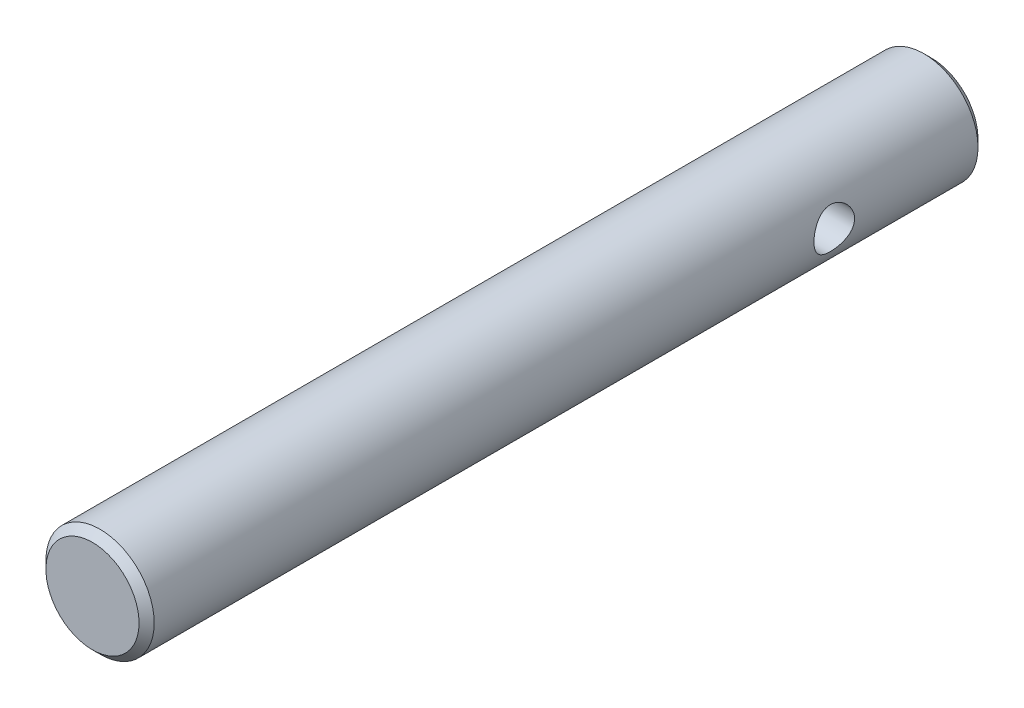
ISO-10303-21;
HEADER;
FILE_DESCRIPTION(('STEP AP214'),'2;1');
FILE_NAME('part.step','',(''),(''),'','','');
FILE_SCHEMA(('AUTOMOTIVE_DESIGN { 1 0 10303 214 1 1 1 1 }'));
ENDSEC;
DATA;
#1=APPLICATION_CONTEXT('core data for automotive mechanical design processes');
#2=APPLICATION_PROTOCOL_DEFINITION('international standard','automotive_design',2000,#1);
#3=PRODUCT_CONTEXT('',#1,'mechanical');
#4=PRODUCT('Part','Part','',(#3));
#5=PRODUCT_RELATED_PRODUCT_CATEGORY('part','',(#4));
#6=PRODUCT_DEFINITION_FORMATION('','',#4);
#7=PRODUCT_DEFINITION_CONTEXT('part definition',#1,'design');
#8=PRODUCT_DEFINITION('design','',#6,#7);
#9=PRODUCT_DEFINITION_SHAPE('','',#8);
#10=(LENGTH_UNIT() NAMED_UNIT(*) SI_UNIT(.MILLI.,.METRE.));
#11=(NAMED_UNIT(*) PLANE_ANGLE_UNIT() SI_UNIT($,.RADIAN.));
#12=(NAMED_UNIT(*) SI_UNIT($,.STERADIAN.) SOLID_ANGLE_UNIT());
#13=UNCERTAINTY_MEASURE_WITH_UNIT(LENGTH_MEASURE(1.E-05),#10,'distance_accuracy_value','');
#14=(GEOMETRIC_REPRESENTATION_CONTEXT(3) GLOBAL_UNCERTAINTY_ASSIGNED_CONTEXT((#13)) GLOBAL_UNIT_ASSIGNED_CONTEXT((#10,
#11,#12)) REPRESENTATION_CONTEXT('',''));
#15=CARTESIAN_POINT('',(0.,0.,0.));
#16=DIRECTION('',(0.,0.,1.));
#17=DIRECTION('',(1.,0.,0.));
#18=AXIS2_PLACEMENT_3D('',#15,#16,#17);
#19=CARTESIAN_POINT('',(0.,0.,30.988));
#20=DIRECTION('',(0.,0.,-1.));
#21=DIRECTION('',(-1.,0.,0.));
#22=AXIS2_PLACEMENT_3D('',#19,#20,#21);
#23=CYLINDRICAL_SURFACE('',#22,4.);
#24=CARTESIAN_POINT('',(0.,0.,-30.4280000000004));
#25=DIRECTION('',(0.,0.,1.));
#26=DIRECTION('',(1.,0.,0.));
#27=AXIS2_PLACEMENT_3D('',#24,#25,#26);
#28=CIRCLE('',#27,4.);
#29=CARTESIAN_POINT('',(4.,0.,-30.4280000000004));
#30=VERTEX_POINT('',#29);
#31=EDGE_CURVE('E52',#30,#30,#28,.T.);
#32=ORIENTED_EDGE('',*,*,#31,.T.);
#33=EDGE_LOOP('',(#32));
#34=FACE_BOUND('',#33,.T.);
#35=CARTESIAN_POINT('',(0.,0.,30.4280000000005));
#36=DIRECTION('',(0.,0.,1.));
#37=DIRECTION('',(1.,0.,0.));
#38=AXIS2_PLACEMENT_3D('',#35,#36,#37);
#39=CIRCLE('',#38,4.);
#40=CARTESIAN_POINT('',(4.,0.,30.4280000000005));
#41=VERTEX_POINT('',#40);
#42=EDGE_CURVE('E56',#41,#41,#39,.F.);
#43=ORIENTED_EDGE('',*,*,#42,.T.);
#44=EDGE_LOOP('',(#43));
#45=FACE_BOUND('',#44,.T.);
#46=CARTESIAN_POINT('',(-4.,0.,-21.312000048));
#47=CARTESIAN_POINT('',(-4.00000217456229,0.0812350613530914,-21.3120029503041));
#48=CARTESIAN_POINT('',(-3.99750379268382,0.162450246606232,-21.3053802875701));
#49=CARTESIAN_POINT('',(-3.98778695934376,0.322453461913108,-21.2791718518346));
#50=CARTESIAN_POINT('',(-3.9805691877861,0.40124183987565,-21.2595879461034));
#51=CARTESIAN_POINT('',(-3.96218832166809,0.55406080138166,-21.2082470434265));
#52=CARTESIAN_POINT('',(-3.95103284058261,0.628100242729138,-21.1765135275329));
#53=CARTESIAN_POINT('',(-3.92588767323404,0.769799332903883,-21.1018936293728));
#54=CARTESIAN_POINT('',(-3.91189722701263,0.837457263922035,-21.0590042557217));
#55=CARTESIAN_POINT('',(-3.88186246258637,0.967346445800347,-20.9613875075525));
#56=CARTESIAN_POINT('',(-3.86576001768271,1.02927076089091,-20.906269774813));
#57=CARTESIAN_POINT('',(-3.83360219847307,1.14324424918895,-20.7865895990249));
#58=CARTESIAN_POINT('',(-3.81754684005002,1.19529039975739,-20.722024275758));
#59=CARTESIAN_POINT('',(-3.7866246927444,1.28998206167075,-20.5822825600992));
#60=CARTESIAN_POINT('',(-3.77182647371093,1.33219397304855,-20.5067956586562));
#61=CARTESIAN_POINT('',(-3.74599858598038,1.40318650715021,-20.3491516658955));
#62=CARTESIAN_POINT('',(-3.73496741253227,1.43197249456068,-20.2669972541917));
#63=CARTESIAN_POINT('',(-3.71854410975964,1.47408435681244,-20.1018832717275));
#64=CARTESIAN_POINT('',(-3.71293922457868,1.48799597942207,-20.0190949709237));
#65=CARTESIAN_POINT('',(-3.70738059517536,1.50179561330119,-19.8521838460265));
#66=CARTESIAN_POINT('',(-3.7074245170968,1.50168941616035,-19.7680615874336));
#67=CARTESIAN_POINT('',(-3.71297509708,1.48790434411387,-19.6062304712365));
#68=CARTESIAN_POINT('',(-3.71815466973933,1.47503813291894,-19.528439088251));
#69=CARTESIAN_POINT('',(-3.73284936242527,1.43744172587463,-19.3762128396527));
#70=CARTESIAN_POINT('',(-3.74236513535189,1.41270974337096,-19.3017784813615));
#71=CARTESIAN_POINT('',(-3.76485700555432,1.35163753127461,-19.1567229160959));
#72=CARTESIAN_POINT('',(-3.77789516429505,1.31508653218354,-19.0862004956404));
#73=CARTESIAN_POINT('',(-3.80594208746548,1.23156078070717,-18.9520542401816));
#74=CARTESIAN_POINT('',(-3.82095153154122,1.1845824293796,-18.8884327983263));
#75=CARTESIAN_POINT('',(-3.85248037754777,1.07781784722672,-18.7653963080846));
#76=CARTESIAN_POINT('',(-3.8690334646095,1.01738302512827,-18.7065513288541));
#77=CARTESIAN_POINT('',(-3.90091727384747,0.887312625230685,-18.5996619994076));
#78=CARTESIAN_POINT('',(-3.91624780792378,0.817675635964258,-18.5516193091526));
#79=CARTESIAN_POINT('',(-3.94426394336848,0.669723465078464,-18.467069563206));
#80=CARTESIAN_POINT('',(-3.95690497882195,0.591290739475325,-18.4307523774412));
#81=CARTESIAN_POINT('',(-3.97778718112333,0.428836870944447,-18.3720173516359));
#82=CARTESIAN_POINT('',(-3.98603030194872,0.34481822851063,-18.3495933381941));
#83=CARTESIAN_POINT('',(-3.99684443177989,0.178375255499351,-18.3203771655244));
#84=CARTESIAN_POINT('',(-3.99969369007435,0.0961036293722292,-18.3128173460782));
#85=CARTESIAN_POINT('',(-4.000258937134,-0.0685724706015413,-18.3113088877681));
#86=CARTESIAN_POINT('',(-3.99797606399853,-0.150976910945741,-18.3173572311639));
#87=CARTESIAN_POINT('',(-3.98871709755099,-0.310262051390368,-18.3423099937956));
#88=CARTESIAN_POINT('',(-3.98192470917108,-0.387233333093915,-18.3607114953637));
#89=CARTESIAN_POINT('',(-3.9645147696683,-0.536941764495201,-18.4091860247489));
#90=CARTESIAN_POINT('',(-3.95389672105101,-0.609678362078839,-18.439260570585));
#91=CARTESIAN_POINT('',(-3.92949624103725,-0.751247781235148,-18.5111863662604));
#92=CARTESIAN_POINT('',(-3.91562999829598,-0.819903101875688,-18.5533576838088));
#93=CARTESIAN_POINT('',(-3.88626671017439,-0.949392734284675,-18.6479180595631));
#94=CARTESIAN_POINT('',(-3.87076906370601,-1.01022414487557,-18.7003108899786));
#95=CARTESIAN_POINT('',(-3.83873328648289,-1.12603082760979,-18.8174040821874));
#96=CARTESIAN_POINT('',(-3.82218695548345,-1.18046157226796,-18.8826421444753));
#97=CARTESIAN_POINT('',(-3.79078814567466,-1.27771053540079,-19.0216513500389));
#98=CARTESIAN_POINT('',(-3.77593581903699,-1.320527711109,-19.0954232587092));
#99=CARTESIAN_POINT('',(-3.74966828320182,-1.39337777567499,-19.2500159585931));
#100=CARTESIAN_POINT('',(-3.73826758726813,-1.423356896562,-19.330864720259));
#101=CARTESIAN_POINT('',(-3.7205403112185,-1.46907887950079,-19.497009743397));
#102=CARTESIAN_POINT('',(-3.71421059220212,-1.4848305490196,-19.5823032187397));
#103=CARTESIAN_POINT('',(-3.70775892866044,-1.50086351857657,-19.7490161474312));
#104=CARTESIAN_POINT('',(-3.70726442570928,-1.50207336314429,-19.8303326221051));
#105=CARTESIAN_POINT('',(-3.71158410777845,-1.49136720537859,-19.9919453117237));
#106=CARTESIAN_POINT('',(-3.71639778942292,-1.47945244765312,-20.0722416226803));
#107=CARTESIAN_POINT('',(-3.73048139681151,-1.44355820551343,-20.2270472294263));
#108=CARTESIAN_POINT('',(-3.73961083511057,-1.41995803230595,-20.301658351109));
#109=CARTESIAN_POINT('',(-3.76121546533404,-1.36169701654392,-20.4459055176189));
#110=CARTESIAN_POINT('',(-3.77369150293274,-1.32703337786834,-20.5155402993016));
#111=CARTESIAN_POINT('',(-3.80139722351573,-1.24552080678915,-20.651826805344));
#112=CARTESIAN_POINT('',(-3.81673696977087,-1.1981283747136,-20.7181308147339));
#113=CARTESIAN_POINT('',(-3.84806245482067,-1.09334490223254,-20.8421415833529));
#114=CARTESIAN_POINT('',(-3.86404839768291,-1.03595068403546,-20.8998455993282));
#115=CARTESIAN_POINT('',(-3.8959042365184,-0.909080437972504,-21.0082019849085));
#116=CARTESIAN_POINT('',(-3.91172104058851,-0.839118683645827,-21.058303784848));
#117=CARTESIAN_POINT('',(-3.94054513838249,-0.691213258711387,-21.1460226910298));
#118=CARTESIAN_POINT('',(-3.9535522133951,-0.613268967433065,-21.1836388255015));
#119=CARTESIAN_POINT('',(-3.9757429232012,-0.447999108335396,-21.246376871353));
#120=CARTESIAN_POINT('',(-3.98473656977501,-0.360413443543307,-21.2708871090273));
#121=CARTESIAN_POINT('',(-3.99686242141922,-0.181875744459777,-21.3036930071921));
#122=CARTESIAN_POINT('',(-3.99999756603872,-0.0909254217870301,-21.3119967994861));
#123=CARTESIAN_POINT('',(-4.,0.,-21.312000048));
#124=B_SPLINE_CURVE_WITH_KNOTS('',3,(#46,#47,#48,#49,#50,#51,#52,#53,#54,#55,#56,#57,#58,#59,
#60,#61,#62,#63,#64,#65,#66,#67,#68,#69,#70,#71,#72,#73,#74,#75,#76,#77,#78,#79,#80,#81,#82,#83,
#84,#85,#86,#87,#88,#89,#90,#91,#92,#93,#94,#95,#96,#97,#98,#99,#100,#101,#102,#103,#104,#105,
#106,#107,#108,#109,#110,#111,#112,#113,#114,#115,#116,#117,#118,#119,#120,#121,#122,#123),
.UNSPECIFIED.,.T.,.F.,(4,2,2,2,2,2,2,2,2,2,2,2,2,2,2,2,2,2,2,2,2,2,2,2,2,2,2,2,2,2,2,2,2,2,2,2,
2,2,4),(0.,0.243369808786064,0.486704563963263,0.729571390821473,0.972503408398828,
1.2247362225782,1.47704609397854,1.7389667987567,2.000782756268,2.2518588150019,
2.50283113970431,2.73878353658288,2.9747714724683,3.21522418251352,3.45576001287294,
3.71246164714863,3.96920270120763,4.22991388399473,4.4905091370877,4.73725034419674,
4.98393683947506,5.22114454151068,5.45838310152006,5.70259239463934,5.94689198331655,
6.20536538608176,6.46386198914262,6.72343087626041,6.98283896758093,7.22558786029549,
7.4683137350789,7.70363166352401,7.93900911211948,8.18672497159329,8.43451967992223,
8.69572356528748,8.95694777562272,9.22948544415576,9.50188632802928),.UNSPECIFIED.);
#125=CARTESIAN_POINT('',(-4.,0.,-21.312000048));
#126=VERTEX_POINT('',#125);
#127=EDGE_CURVE('E61',#126,#126,#124,.T.);
#128=ORIENTED_EDGE('',*,*,#127,.T.);
#129=EDGE_LOOP('',(#128));
#130=FACE_BOUND('',#129,.T.);
#131=CARTESIAN_POINT('',(4.,0.,-21.312000048));
#132=CARTESIAN_POINT('',(4.00000217456229,-0.0812350613530914,-21.3120029503041));
#133=CARTESIAN_POINT('',(3.99750379268382,-0.162450246606232,-21.3053802875701));
#134=CARTESIAN_POINT('',(3.98778695934376,-0.322453461913108,-21.2791718518346));
#135=CARTESIAN_POINT('',(3.9805691877861,-0.40124183987565,-21.2595879461034));
#136=CARTESIAN_POINT('',(3.96218832166809,-0.55406080138166,-21.2082470434265));
#137=CARTESIAN_POINT('',(3.95103284058261,-0.628100242729138,-21.1765135275329));
#138=CARTESIAN_POINT('',(3.92588767323404,-0.769799332903883,-21.1018936293728));
#139=CARTESIAN_POINT('',(3.91189722701263,-0.837457263922035,-21.0590042557217));
#140=CARTESIAN_POINT('',(3.88186246258637,-0.967346445800347,-20.9613875075525));
#141=CARTESIAN_POINT('',(3.86576001768271,-1.02927076089091,-20.906269774813));
#142=CARTESIAN_POINT('',(3.83360219847307,-1.14324424918895,-20.7865895990249));
#143=CARTESIAN_POINT('',(3.81754684005002,-1.19529039975739,-20.722024275758));
#144=CARTESIAN_POINT('',(3.7866246927444,-1.28998206167075,-20.5822825600992));
#145=CARTESIAN_POINT('',(3.77182647371093,-1.33219397304855,-20.5067956586562));
#146=CARTESIAN_POINT('',(3.74599858598038,-1.40318650715021,-20.3491516658955));
#147=CARTESIAN_POINT('',(3.73496741253227,-1.43197249456068,-20.2669972541917));
#148=CARTESIAN_POINT('',(3.71854410975964,-1.47408435681244,-20.1018832717275));
#149=CARTESIAN_POINT('',(3.71293922457868,-1.48799597942207,-20.0190949709237));
#150=CARTESIAN_POINT('',(3.70738059517536,-1.50179561330119,-19.8521838460265));
#151=CARTESIAN_POINT('',(3.7074245170968,-1.50168941616035,-19.7680615874336));
#152=CARTESIAN_POINT('',(3.71297509708,-1.48790434411387,-19.6062304712365));
#153=CARTESIAN_POINT('',(3.71815466973933,-1.47503813291894,-19.528439088251));
#154=CARTESIAN_POINT('',(3.73284936242527,-1.43744172587463,-19.3762128396527));
#155=CARTESIAN_POINT('',(3.74236513535189,-1.41270974337096,-19.3017784813615));
#156=CARTESIAN_POINT('',(3.76485700555432,-1.35163753127461,-19.1567229160959));
#157=CARTESIAN_POINT('',(3.77789516429505,-1.31508653218354,-19.0862004956404));
#158=CARTESIAN_POINT('',(3.80594208746548,-1.23156078070717,-18.9520542401816));
#159=CARTESIAN_POINT('',(3.82095153154122,-1.1845824293796,-18.8884327983263));
#160=CARTESIAN_POINT('',(3.85248037754777,-1.07781784722672,-18.7653963080846));
#161=CARTESIAN_POINT('',(3.8690334646095,-1.01738302512827,-18.7065513288541));
#162=CARTESIAN_POINT('',(3.90091727384747,-0.887312625230685,-18.5996619994076));
#163=CARTESIAN_POINT('',(3.91624780792378,-0.817675635964258,-18.5516193091526));
#164=CARTESIAN_POINT('',(3.94426394336848,-0.669723465078464,-18.467069563206));
#165=CARTESIAN_POINT('',(3.95690497882195,-0.591290739475325,-18.4307523774412));
#166=CARTESIAN_POINT('',(3.97778718112333,-0.428836870944447,-18.3720173516359));
#167=CARTESIAN_POINT('',(3.98603030194872,-0.34481822851063,-18.3495933381941));
#168=CARTESIAN_POINT('',(3.99684443177989,-0.178375255499351,-18.3203771655244));
#169=CARTESIAN_POINT('',(3.99969369007435,-0.0961036293722292,-18.3128173460782));
#170=CARTESIAN_POINT('',(4.000258937134,0.0685724706015413,-18.3113088877681));
#171=CARTESIAN_POINT('',(3.99797606399853,0.150976910945741,-18.3173572311639));
#172=CARTESIAN_POINT('',(3.98871709755099,0.310262051390368,-18.3423099937956));
#173=CARTESIAN_POINT('',(3.98192470917108,0.387233333093915,-18.3607114953637));
#174=CARTESIAN_POINT('',(3.9645147696683,0.536941764495201,-18.4091860247489));
#175=CARTESIAN_POINT('',(3.95389672105101,0.609678362078839,-18.439260570585));
#176=CARTESIAN_POINT('',(3.92949624103725,0.751247781235148,-18.5111863662604));
#177=CARTESIAN_POINT('',(3.91562999829598,0.819903101875688,-18.5533576838088));
#178=CARTESIAN_POINT('',(3.88626671017439,0.949392734284675,-18.6479180595631));
#179=CARTESIAN_POINT('',(3.87076906370601,1.01022414487557,-18.7003108899786));
#180=CARTESIAN_POINT('',(3.83873328648289,1.12603082760979,-18.8174040821874));
#181=CARTESIAN_POINT('',(3.82218695548345,1.18046157226796,-18.8826421444753));
#182=CARTESIAN_POINT('',(3.79078814567466,1.27771053540079,-19.0216513500389));
#183=CARTESIAN_POINT('',(3.77593581903699,1.320527711109,-19.0954232587092));
#184=CARTESIAN_POINT('',(3.74966828320182,1.39337777567499,-19.2500159585931));
#185=CARTESIAN_POINT('',(3.73826758726813,1.423356896562,-19.330864720259));
#186=CARTESIAN_POINT('',(3.7205403112185,1.46907887950079,-19.497009743397));
#187=CARTESIAN_POINT('',(3.71421059220212,1.4848305490196,-19.5823032187397));
#188=CARTESIAN_POINT('',(3.70775892866044,1.50086351857657,-19.7490161474312));
#189=CARTESIAN_POINT('',(3.70726442570928,1.50207336314429,-19.8303326221051));
#190=CARTESIAN_POINT('',(3.71158410777845,1.49136720537859,-19.9919453117237));
#191=CARTESIAN_POINT('',(3.71639778942292,1.47945244765312,-20.0722416226803));
#192=CARTESIAN_POINT('',(3.73048139681151,1.44355820551343,-20.2270472294263));
#193=CARTESIAN_POINT('',(3.73961083511057,1.41995803230595,-20.301658351109));
#194=CARTESIAN_POINT('',(3.76121546533404,1.36169701654392,-20.4459055176189));
#195=CARTESIAN_POINT('',(3.77369150293274,1.32703337786834,-20.5155402993016));
#196=CARTESIAN_POINT('',(3.80139722351573,1.24552080678915,-20.651826805344));
#197=CARTESIAN_POINT('',(3.81673696977087,1.1981283747136,-20.7181308147339));
#198=CARTESIAN_POINT('',(3.84806245482067,1.09334490223254,-20.8421415833529));
#199=CARTESIAN_POINT('',(3.86404839768291,1.03595068403546,-20.8998455993282));
#200=CARTESIAN_POINT('',(3.8959042365184,0.909080437972504,-21.0082019849085));
#201=CARTESIAN_POINT('',(3.91172104058851,0.839118683645827,-21.058303784848));
#202=CARTESIAN_POINT('',(3.94054513838249,0.691213258711387,-21.1460226910298));
#203=CARTESIAN_POINT('',(3.9535522133951,0.613268967433065,-21.1836388255015));
#204=CARTESIAN_POINT('',(3.9757429232012,0.447999108335396,-21.246376871353));
#205=CARTESIAN_POINT('',(3.98473656977501,0.360413443543307,-21.2708871090273));
#206=CARTESIAN_POINT('',(3.99686242141922,0.181875744459777,-21.3036930071921));
#207=CARTESIAN_POINT('',(3.99999756603872,0.0909254217870301,-21.3119967994861));
#208=CARTESIAN_POINT('',(4.,0.,-21.312000048));
#209=B_SPLINE_CURVE_WITH_KNOTS('',3,(#131,#132,#133,#134,#135,#136,#137,#138,#139,#140,#141,
#142,#143,#144,#145,#146,#147,#148,#149,#150,#151,#152,#153,#154,#155,#156,#157,#158,#159,#160,
#161,#162,#163,#164,#165,#166,#167,#168,#169,#170,#171,#172,#173,#174,#175,#176,#177,#178,#179,
#180,#181,#182,#183,#184,#185,#186,#187,#188,#189,#190,#191,#192,#193,#194,#195,#196,#197,#198,
#199,#200,#201,#202,#203,#204,#205,#206,#207,#208),.UNSPECIFIED.,.T.,.F.,(4,2,2,2,2,2,2,2,2,2,2,
2,2,2,2,2,2,2,2,2,2,2,2,2,2,2,2,2,2,2,2,2,2,2,2,2,2,2,4),(0.,0.243369808786064,
0.486704563963263,0.729571390821473,0.972503408398828,1.2247362225782,1.47704609397854,
1.7389667987567,2.000782756268,2.2518588150019,2.50283113970431,2.73878353658288,
2.9747714724683,3.21522418251352,3.45576001287294,3.71246164714863,3.96920270120763,
4.22991388399473,4.4905091370877,4.73725034419674,4.98393683947506,5.22114454151068,
5.45838310152006,5.70259239463934,5.94689198331655,6.20536538608176,6.46386198914262,
6.72343087626041,6.98283896758093,7.22558786029549,7.4683137350789,7.70363166352401,
7.93900911211948,8.18672497159329,8.43451967992223,8.69572356528748,8.95694777562272,
9.22948544415576,9.50188632802928),.UNSPECIFIED.);
#210=CARTESIAN_POINT('',(4.,0.,-21.312000048));
#211=VERTEX_POINT('',#210);
#212=EDGE_CURVE('E69',#211,#211,#209,.T.);
#213=ORIENTED_EDGE('',*,*,#212,.T.);
#214=EDGE_LOOP('',(#213));
#215=FACE_BOUND('',#214,.T.);
#216=ADVANCED_FACE('F41',(#34,#45,#130,#215),#23,.T.);
#217=CARTESIAN_POINT('',(0.,0.,30.988));
#218=DIRECTION('',(0.,0.,1.));
#219=DIRECTION('',(1.,0.,0.));
#220=AXIS2_PLACEMENT_3D('',#217,#218,#219);
#221=PLANE('',#220);
#222=CARTESIAN_POINT('',(0.,0.,30.988));
#223=DIRECTION('',(0.,0.,1.));
#224=DIRECTION('',(1.,0.,0.));
#225=AXIS2_PLACEMENT_3D('',#222,#223,#224);
#226=CIRCLE('',#225,3.44000000000047);
#227=CARTESIAN_POINT('',(3.44000000000047,0.,30.988));
#228=VERTEX_POINT('',#227);
#229=EDGE_CURVE('E10',#228,#228,#226,.T.);
#230=ORIENTED_EDGE('',*,*,#229,.T.);
#231=EDGE_LOOP('',(#230));
#232=FACE_BOUND('',#231,.T.);
#233=ADVANCED_FACE('F84',(#232),#221,.T.);
#234=CARTESIAN_POINT('',(0.,0.,-30.988));
#235=DIRECTION('',(0.,0.,1.));
#236=DIRECTION('',(1.,0.,0.));
#237=AXIS2_PLACEMENT_3D('',#234,#235,#236);
#238=PLANE('',#237);
#239=CARTESIAN_POINT('',(0.,0.,-30.988));
#240=DIRECTION('',(0.,0.,1.));
#241=DIRECTION('',(1.,0.,0.));
#242=AXIS2_PLACEMENT_3D('',#239,#240,#241);
#243=CIRCLE('',#242,3.44000000000045);
#244=CARTESIAN_POINT('',(3.44000000000045,0.,-30.988));
#245=VERTEX_POINT('',#244);
#246=EDGE_CURVE('E48',#245,#245,#243,.F.);
#247=ORIENTED_EDGE('',*,*,#246,.T.);
#248=EDGE_LOOP('',(#247));
#249=FACE_BOUND('',#248,.T.);
#250=ADVANCED_FACE('F80',(#249),#238,.F.);
#251=CARTESIAN_POINT('',(-4.,0.,-19.812));
#252=DIRECTION('',(1.,0.,0.));
#253=DIRECTION('',(0.,0.,-1.));
#254=AXIS2_PLACEMENT_3D('',#251,#252,#253);
#255=CYLINDRICAL_SURFACE('',#254,1.500000048);
#256=ORIENTED_EDGE('',*,*,#212,.F.);
#257=EDGE_LOOP('',(#256));
#258=FACE_BOUND('',#257,.T.);
#259=ORIENTED_EDGE('',*,*,#127,.F.);
#260=EDGE_LOOP('',(#259));
#261=FACE_BOUND('',#260,.T.);
#262=ADVANCED_FACE('F75',(#258,#261),#255,.F.);
#263=CARTESIAN_POINT('',(0.,0.,-30.4280000000004));
#264=DIRECTION('',(0.,0.,1.));
#265=DIRECTION('',(1.,0.,0.));
#266=AXIS2_PLACEMENT_3D('',#263,#264,#265);
#267=CONICAL_SURFACE('',#266,4.,0.785398163397445);
#268=ORIENTED_EDGE('',*,*,#246,.F.);
#269=EDGE_LOOP('',(#268));
#270=FACE_BOUND('',#269,.T.);
#271=ORIENTED_EDGE('',*,*,#31,.F.);
#272=EDGE_LOOP('',(#271));
#273=FACE_BOUND('',#272,.T.);
#274=ADVANCED_FACE('F79',(#270,#273),#267,.T.);
#275=CARTESIAN_POINT('',(0.,0.,30.988));
#276=DIRECTION('',(0.,0.,-1.));
#277=DIRECTION('',(-1.,0.,0.));
#278=AXIS2_PLACEMENT_3D('',#275,#276,#277);
#279=CONICAL_SURFACE('',#278,3.44000000000047,0.785398163397451);
#280=ORIENTED_EDGE('',*,*,#42,.F.);
#281=EDGE_LOOP('',(#280));
#282=FACE_BOUND('',#281,.T.);
#283=ORIENTED_EDGE('',*,*,#229,.F.);
#284=EDGE_LOOP('',(#283));
#285=FACE_BOUND('',#284,.T.);
#286=ADVANCED_FACE('F43',(#282,#285),#279,.T.);
#287=CLOSED_SHELL('',(#216,#233,#250,#262,#274,#286));
#288=MANIFOLD_SOLID_BREP('B2',#287);
#289=ADVANCED_BREP_SHAPE_REPRESENTATION('',(#18,#288),#14);
#290=SHAPE_DEFINITION_REPRESENTATION(#9,#289);
ENDSEC;
END-ISO-10303-21;
